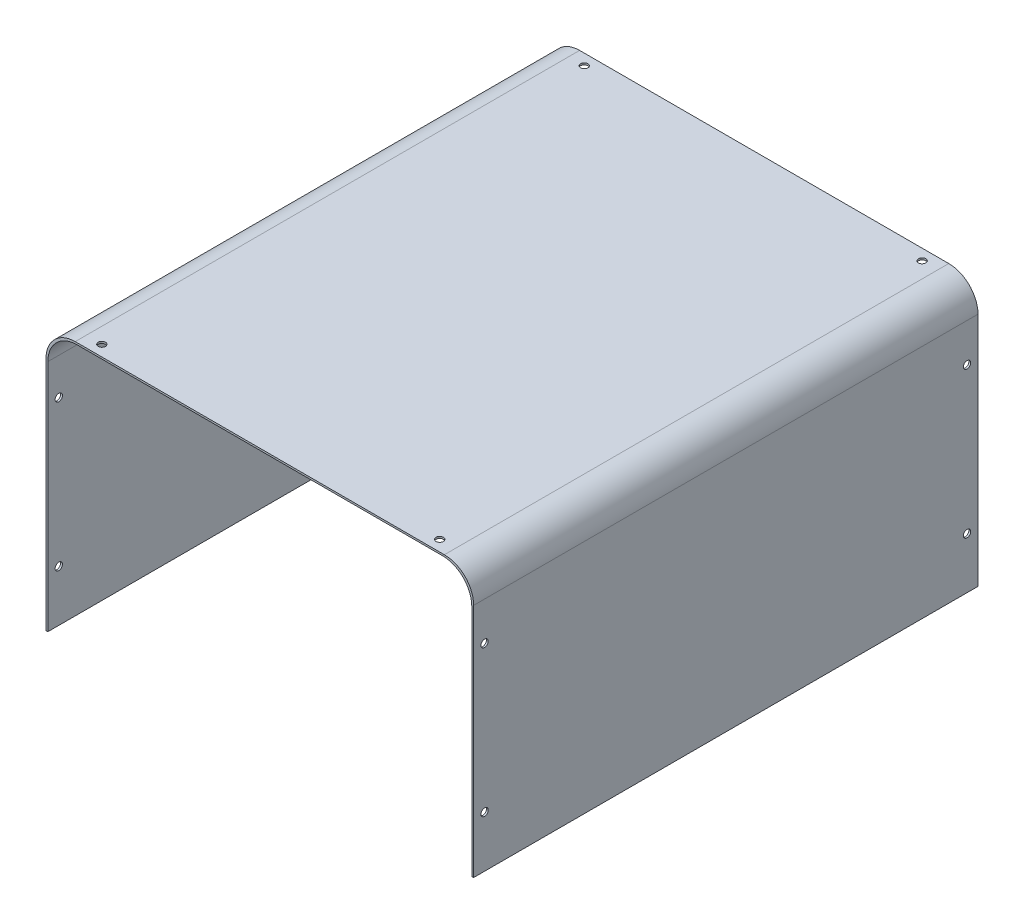
ISO-10303-21;
HEADER;
FILE_DESCRIPTION(('STEP AP214'),'2;1');
FILE_NAME('part.step','',(''),(''),'','','');
FILE_SCHEMA(('AUTOMOTIVE_DESIGN { 1 0 10303 214 1 1 1 1 }'));
ENDSEC;
DATA;
#1=APPLICATION_CONTEXT('core data for automotive mechanical design processes');
#2=APPLICATION_PROTOCOL_DEFINITION('international standard','automotive_design',2000,#1);
#3=PRODUCT_CONTEXT('',#1,'mechanical');
#4=PRODUCT('Part','Part','',(#3));
#5=PRODUCT_RELATED_PRODUCT_CATEGORY('part','',(#4));
#6=PRODUCT_DEFINITION_FORMATION('','',#4);
#7=PRODUCT_DEFINITION_CONTEXT('part definition',#1,'design');
#8=PRODUCT_DEFINITION('design','',#6,#7);
#9=PRODUCT_DEFINITION_SHAPE('','',#8);
#10=(LENGTH_UNIT() NAMED_UNIT(*) SI_UNIT(.MILLI.,.METRE.));
#11=(NAMED_UNIT(*) PLANE_ANGLE_UNIT() SI_UNIT($,.RADIAN.));
#12=(NAMED_UNIT(*) SI_UNIT($,.STERADIAN.) SOLID_ANGLE_UNIT());
#13=UNCERTAINTY_MEASURE_WITH_UNIT(LENGTH_MEASURE(1.E-05),#10,'distance_accuracy_value','');
#14=(GEOMETRIC_REPRESENTATION_CONTEXT(3) GLOBAL_UNCERTAINTY_ASSIGNED_CONTEXT((#13)) GLOBAL_UNIT_ASSIGNED_CONTEXT((#10,
#11,#12)) REPRESENTATION_CONTEXT('',''));
#15=CARTESIAN_POINT('',(0.,0.,0.));
#16=DIRECTION('',(0.,0.,1.));
#17=DIRECTION('',(1.,0.,0.));
#18=AXIS2_PLACEMENT_3D('',#15,#16,#17);
#19=CARTESIAN_POINT('',(0.,0.,0.));
#20=DIRECTION('',(0.,-1.,0.));
#21=DIRECTION('',(0.,0.,-1.));
#22=AXIS2_PLACEMENT_3D('',#19,#20,#21);
#23=PLANE('',#22);
#24=DIRECTION('',(0.,0.,1.));
#25=VECTOR('',#24,1.);
#26=CARTESIAN_POINT('',(91.2342816853104,0.,0.));
#27=LINE('',#26,#25);
#28=CARTESIAN_POINT('',(91.2342816853104,0.,-65.7659591772385));
#29=VERTEX_POINT('',#28);
#30=CARTESIAN_POINT('',(91.2342816853104,0.,72.2340408227615));
#31=VERTEX_POINT('',#30);
#32=EDGE_CURVE('E216',#29,#31,#27,.T.);
#33=ORIENTED_EDGE('',*,*,#32,.F.);
#34=DIRECTION('',(1.,0.,0.));
#35=VECTOR('',#34,1.);
#36=CARTESIAN_POINT('',(-25.2657183146879,0.,-65.7659591772385));
#37=LINE('',#36,#35);
#38=CARTESIAN_POINT('',(91.7342816853121,0.,-65.7659591772385));
#39=VERTEX_POINT('',#38);
#40=EDGE_CURVE('E194',#29,#39,#37,.T.);
#41=ORIENTED_EDGE('',*,*,#40,.T.);
#42=DIRECTION('',(0.,0.,1.));
#43=VECTOR('',#42,1.);
#44=CARTESIAN_POINT('',(91.7342816853121,0.,-65.7659591772385));
#45=LINE('',#44,#43);
#46=CARTESIAN_POINT('',(91.7342816853121,0.,72.2340408227615));
#47=VERTEX_POINT('',#46);
#48=EDGE_CURVE('E191',#39,#47,#45,.T.);
#49=ORIENTED_EDGE('',*,*,#48,.T.);
#50=DIRECTION('',(1.,0.,0.));
#51=VECTOR('',#50,1.);
#52=CARTESIAN_POINT('',(-25.2657183146879,0.,72.2340408227615));
#53=LINE('',#52,#51);
#54=EDGE_CURVE('E179',#31,#47,#53,.T.);
#55=ORIENTED_EDGE('',*,*,#54,.F.);
#56=EDGE_LOOP('',(#33,#41,#49,#55));
#57=FACE_BOUND('',#56,.T.);
#58=ADVANCED_FACE('F35',(#57),#23,.T.);
#59=CARTESIAN_POINT('',(91.7342816853121,72.5,-65.7659591772385));
#60=DIRECTION('',(1.,0.,0.));
#61=DIRECTION('',(0.,0.,-1.));
#62=AXIS2_PLACEMENT_3D('',#59,#60,#61);
#63=PLANE('',#62);
#64=CARTESIAN_POINT('',(91.7342816853121,14.,-62.7659591772386));
#65=DIRECTION('',(1.,0.,0.));
#66=DIRECTION('',(0.,0.,-1.));
#67=AXIS2_PLACEMENT_3D('',#64,#65,#66);
#68=CIRCLE('',#67,0.999999999999998);
#69=CARTESIAN_POINT('',(91.7342816853121,14.,-63.7659591772386));
#70=VERTEX_POINT('',#69);
#71=EDGE_CURVE('E147',#70,#70,#68,.T.);
#72=ORIENTED_EDGE('',*,*,#71,.F.);
#73=EDGE_LOOP('',(#72));
#74=FACE_BOUND('',#73,.T.);
#75=CARTESIAN_POINT('',(91.7342816853121,54.,69.2340408227615));
#76=DIRECTION('',(1.,0.,0.));
#77=DIRECTION('',(0.,0.,-1.));
#78=AXIS2_PLACEMENT_3D('',#75,#76,#77);
#79=CIRCLE('',#78,0.999999999999998);
#80=CARTESIAN_POINT('',(91.7342816853121,54.,68.2340408227615));
#81=VERTEX_POINT('',#80);
#82=EDGE_CURVE('E236',#81,#81,#79,.T.);
#83=ORIENTED_EDGE('',*,*,#82,.F.);
#84=EDGE_LOOP('',(#83));
#85=FACE_BOUND('',#84,.T.);
#86=CARTESIAN_POINT('',(91.7342816853121,14.,69.2340408227615));
#87=DIRECTION('',(1.,0.,0.));
#88=DIRECTION('',(0.,0.,-1.));
#89=AXIS2_PLACEMENT_3D('',#86,#87,#88);
#90=CIRCLE('',#89,0.999999999999998);
#91=CARTESIAN_POINT('',(91.7342816853121,14.,68.2340408227615));
#92=VERTEX_POINT('',#91);
#93=EDGE_CURVE('E232',#92,#92,#90,.T.);
#94=ORIENTED_EDGE('',*,*,#93,.F.);
#95=EDGE_LOOP('',(#94));
#96=FACE_BOUND('',#95,.T.);
#97=CARTESIAN_POINT('',(91.7342816853121,54.,-62.7659591772386));
#98=DIRECTION('',(1.,0.,0.));
#99=DIRECTION('',(0.,0.,-1.));
#100=AXIS2_PLACEMENT_3D('',#97,#98,#99);
#101=CIRCLE('',#100,0.999999999999998);
#102=CARTESIAN_POINT('',(91.7342816853121,54.,-63.7659591772386));
#103=VERTEX_POINT('',#102);
#104=EDGE_CURVE('E228',#103,#103,#101,.T.);
#105=ORIENTED_EDGE('',*,*,#104,.F.);
#106=EDGE_LOOP('',(#105));
#107=FACE_BOUND('',#106,.T.);
#108=DIRECTION('',(0.,-1.,0.));
#109=VECTOR('',#108,1.);
#110=CARTESIAN_POINT('',(91.7342816853121,72.5,-65.7659591772385));
#111=LINE('',#110,#109);
#112=CARTESIAN_POINT('',(91.7342816853121,64.4999999999999,-65.7659591772385));
#113=VERTEX_POINT('',#112);
#114=EDGE_CURVE('E203',#113,#39,#111,.T.);
#115=ORIENTED_EDGE('',*,*,#114,.F.);
#116=DIRECTION('',(0.,0.,-1.));
#117=VECTOR('',#116,1.);
#118=CARTESIAN_POINT('',(91.7342816853121,64.4999999999999,74.2340408227615));
#119=LINE('',#118,#117);
#120=CARTESIAN_POINT('',(91.7342816853121,64.4999999999999,72.2340408227615));
#121=VERTEX_POINT('',#120);
#122=EDGE_CURVE('E168',#121,#113,#119,.T.);
#123=ORIENTED_EDGE('',*,*,#122,.F.);
#124=DIRECTION('',(0.,-1.,0.));
#125=VECTOR('',#124,1.);
#126=CARTESIAN_POINT('',(91.7342816853121,72.5,72.2340408227615));
#127=LINE('',#126,#125);
#128=EDGE_CURVE('E206',#121,#47,#127,.T.);
#129=ORIENTED_EDGE('',*,*,#128,.T.);
#130=ORIENTED_EDGE('',*,*,#48,.F.);
#131=EDGE_LOOP('',(#115,#123,#129,#130));
#132=FACE_BOUND('',#131,.T.);
#133=ADVANCED_FACE('F256',(#74,#85,#96,#107,#132),#63,.T.);
#134=CARTESIAN_POINT('',(-25.2657183146879,72.5,-65.7659591772385));
#135=DIRECTION('',(1.,0.,0.));
#136=DIRECTION('',(0.,0.,-1.));
#137=AXIS2_PLACEMENT_3D('',#134,#135,#136);
#138=PLANE('',#137);
#139=CARTESIAN_POINT('',(-25.2657183146879,14.,-62.7659591772385));
#140=DIRECTION('',(-1.,0.,0.));
#141=DIRECTION('',(0.,0.,1.));
#142=AXIS2_PLACEMENT_3D('',#139,#140,#141);
#143=CIRCLE('',#142,0.999999999999998);
#144=CARTESIAN_POINT('',(-25.2657183146879,14.,-61.7659591772385));
#145=VERTEX_POINT('',#144);
#146=EDGE_CURVE('E332',#145,#145,#143,.T.);
#147=ORIENTED_EDGE('',*,*,#146,.F.);
#148=EDGE_LOOP('',(#147));
#149=FACE_BOUND('',#148,.T.);
#150=CARTESIAN_POINT('',(-25.2657183146879,54.,69.2340408227615));
#151=DIRECTION('',(-1.,0.,0.));
#152=DIRECTION('',(0.,0.,-1.));
#153=AXIS2_PLACEMENT_3D('',#150,#151,#152);
#154=CIRCLE('',#153,0.999999999999998);
#155=CARTESIAN_POINT('',(-25.2657183146879,54.,68.2340408227615));
#156=VERTEX_POINT('',#155);
#157=EDGE_CURVE('E336',#156,#156,#154,.T.);
#158=ORIENTED_EDGE('',*,*,#157,.F.);
#159=EDGE_LOOP('',(#158));
#160=FACE_BOUND('',#159,.T.);
#161=CARTESIAN_POINT('',(-25.2657183146879,14.,69.2340408227615));
#162=DIRECTION('',(-1.,0.,0.));
#163=DIRECTION('',(0.,0.,-1.));
#164=AXIS2_PLACEMENT_3D('',#161,#162,#163);
#165=CIRCLE('',#164,0.999999999999998);
#166=CARTESIAN_POINT('',(-25.2657183146879,14.,68.2340408227615));
#167=VERTEX_POINT('',#166);
#168=EDGE_CURVE('E340',#167,#167,#165,.T.);
#169=ORIENTED_EDGE('',*,*,#168,.F.);
#170=EDGE_LOOP('',(#169));
#171=FACE_BOUND('',#170,.T.);
#172=CARTESIAN_POINT('',(-25.2657183146879,54.,-62.7659591772385));
#173=DIRECTION('',(-1.,0.,0.));
#174=DIRECTION('',(0.,0.,1.));
#175=AXIS2_PLACEMENT_3D('',#172,#173,#174);
#176=CIRCLE('',#175,0.999999999999998);
#177=CARTESIAN_POINT('',(-25.2657183146879,54.,-61.7659591772385));
#178=VERTEX_POINT('',#177);
#179=EDGE_CURVE('E224',#178,#178,#176,.T.);
#180=ORIENTED_EDGE('',*,*,#179,.F.);
#181=EDGE_LOOP('',(#180));
#182=FACE_BOUND('',#181,.T.);
#183=DIRECTION('',(0.,0.,-1.));
#184=VECTOR('',#183,1.);
#185=CARTESIAN_POINT('',(-25.2657183146879,64.4999999999999,74.2340408227615));
#186=LINE('',#185,#184);
#187=CARTESIAN_POINT('',(-25.2657183146879,64.4999999999999,72.2340408227615));
#188=VERTEX_POINT('',#187);
#189=CARTESIAN_POINT('',(-25.2657183146879,64.4999999999999,-65.7659591772385));
#190=VERTEX_POINT('',#189);
#191=EDGE_CURVE('E167',#188,#190,#186,.T.);
#192=ORIENTED_EDGE('',*,*,#191,.T.);
#193=DIRECTION('',(0.,-1.,0.));
#194=VECTOR('',#193,1.);
#195=CARTESIAN_POINT('',(-25.2657183146879,72.5,-65.7659591772385));
#196=LINE('',#195,#194);
#197=CARTESIAN_POINT('',(-25.2657183146879,0.,-65.7659591772385));
#198=VERTEX_POINT('',#197);
#199=EDGE_CURVE('E201',#190,#198,#196,.T.);
#200=ORIENTED_EDGE('',*,*,#199,.T.);
#201=DIRECTION('',(0.,0.,1.));
#202=VECTOR('',#201,1.);
#203=CARTESIAN_POINT('',(-25.2657183146879,0.,-65.7659591772385));
#204=LINE('',#203,#202);
#205=CARTESIAN_POINT('',(-25.2657183146879,0.,72.2340408227615));
#206=VERTEX_POINT('',#205);
#207=EDGE_CURVE('E184',#198,#206,#204,.T.);
#208=ORIENTED_EDGE('',*,*,#207,.T.);
#209=DIRECTION('',(0.,-1.,0.));
#210=VECTOR('',#209,1.);
#211=CARTESIAN_POINT('',(-25.2657183146879,72.5,72.2340408227615));
#212=LINE('',#211,#210);
#213=EDGE_CURVE('E187',#188,#206,#212,.T.);
#214=ORIENTED_EDGE('',*,*,#213,.F.);
#215=EDGE_LOOP('',(#192,#200,#208,#214));
#216=FACE_BOUND('',#215,.T.);
#217=ADVANCED_FACE('F259',(#149,#160,#171,#182,#216),#138,.F.);
#218=CARTESIAN_POINT('',(0.,72.5,0.));
#219=DIRECTION('',(0.,-1.,0.));
#220=DIRECTION('',(0.,0.,-1.));
#221=AXIS2_PLACEMENT_3D('',#218,#219,#220);
#222=PLANE('',#221);
#223=CARTESIAN_POINT('',(79.4542912087594,72.5,-62.7659591772385));
#224=DIRECTION('',(0.,-1.,0.));
#225=DIRECTION('',(0.,0.,-1.));
#226=AXIS2_PLACEMENT_3D('',#223,#224,#225);
#227=CIRCLE('',#226,0.999999999999998);
#228=CARTESIAN_POINT('',(79.4542912087594,72.5,-63.7659591772385));
#229=VERTEX_POINT('',#228);
#230=EDGE_CURVE('E407',#229,#229,#227,.T.);
#231=ORIENTED_EDGE('',*,*,#230,.T.);
#232=EDGE_LOOP('',(#231));
#233=FACE_BOUND('',#232,.T.);
#234=CARTESIAN_POINT('',(-12.9857278381368,72.5,-62.7659591772385));
#235=DIRECTION('',(0.,-1.,0.));
#236=DIRECTION('',(0.,0.,-1.));
#237=AXIS2_PLACEMENT_3D('',#234,#235,#236);
#238=CIRCLE('',#237,0.999999999999998);
#239=CARTESIAN_POINT('',(-12.9857278381368,72.5,-63.7659591772385));
#240=VERTEX_POINT('',#239);
#241=EDGE_CURVE('E404',#240,#240,#238,.T.);
#242=ORIENTED_EDGE('',*,*,#241,.T.);
#243=EDGE_LOOP('',(#242));
#244=FACE_BOUND('',#243,.T.);
#245=CARTESIAN_POINT('',(-12.9857274004644,72.5,69.2340408227615));
#246=DIRECTION('',(0.,-1.,0.));
#247=DIRECTION('',(0.,0.,-1.));
#248=AXIS2_PLACEMENT_3D('',#245,#246,#247);
#249=CIRCLE('',#248,1.);
#250=CARTESIAN_POINT('',(-12.9857274004644,72.5,68.2340408227615));
#251=VERTEX_POINT('',#250);
#252=EDGE_CURVE('E401',#251,#251,#249,.T.);
#253=ORIENTED_EDGE('',*,*,#252,.T.);
#254=EDGE_LOOP('',(#253));
#255=FACE_BOUND('',#254,.T.);
#256=CARTESIAN_POINT('',(79.4542912087594,72.5,69.2340408227615));
#257=DIRECTION('',(0.,-1.,0.));
#258=DIRECTION('',(0.,0.,-1.));
#259=AXIS2_PLACEMENT_3D('',#256,#257,#258);
#260=CIRCLE('',#259,0.999999999999998);
#261=CARTESIAN_POINT('',(79.4542912087594,72.5,68.2340408227615));
#262=VERTEX_POINT('',#261);
#263=EDGE_CURVE('E398',#262,#262,#260,.T.);
#264=ORIENTED_EDGE('',*,*,#263,.T.);
#265=EDGE_LOOP('',(#264));
#266=FACE_BOUND('',#265,.T.);
#267=DIRECTION('',(1.,0.,0.));
#268=VECTOR('',#267,1.);
#269=CARTESIAN_POINT('',(-25.2657183146879,72.5,-65.7659591772385));
#270=LINE('',#269,#268);
#271=CARTESIAN_POINT('',(-17.2657183146878,72.5,-65.7659591772385));
#272=VERTEX_POINT('',#271);
#273=CARTESIAN_POINT('',(83.734281685312,72.5,-65.7659591772385));
#274=VERTEX_POINT('',#273);
#275=EDGE_CURVE('E183',#272,#274,#270,.T.);
#276=ORIENTED_EDGE('',*,*,#275,.F.);
#277=DIRECTION('',(0.,0.,-1.));
#278=VECTOR('',#277,1.);
#279=CARTESIAN_POINT('',(-17.2657183146879,72.5,74.2340408227615));
#280=LINE('',#279,#278);
#281=CARTESIAN_POINT('',(-17.2657183146879,72.5,72.2340408227615));
#282=VERTEX_POINT('',#281);
#283=EDGE_CURVE('E211',#272,#282,#280,.F.);
#284=ORIENTED_EDGE('',*,*,#283,.T.);
#285=DIRECTION('',(1.,0.,0.));
#286=VECTOR('',#285,1.);
#287=CARTESIAN_POINT('',(-25.2657183146879,72.5,72.2340408227615));
#288=LINE('',#287,#286);
#289=CARTESIAN_POINT('',(83.734281685312,72.5,72.2340408227615));
#290=VERTEX_POINT('',#289);
#291=EDGE_CURVE('E180',#282,#290,#288,.T.);
#292=ORIENTED_EDGE('',*,*,#291,.T.);
#293=DIRECTION('',(0.,0.,-1.));
#294=VECTOR('',#293,1.);
#295=CARTESIAN_POINT('',(83.7342816853121,72.5,74.2340408227615));
#296=LINE('',#295,#294);
#297=EDGE_CURVE('E209',#274,#290,#296,.F.);
#298=ORIENTED_EDGE('',*,*,#297,.F.);
#299=EDGE_LOOP('',(#276,#284,#292,#298));
#300=FACE_BOUND('',#299,.T.);
#301=ADVANCED_FACE('F278',(#233,#244,#255,#266,#300),#222,.F.);
#302=CARTESIAN_POINT('',(-25.2657183146879,72.5,72.2340408227615));
#303=DIRECTION('',(0.,0.,-1.));
#304=DIRECTION('',(-1.,0.,0.));
#305=AXIS2_PLACEMENT_3D('',#302,#303,#304);
#306=PLANE('',#305);
#307=CARTESIAN_POINT('',(83.2342816853104,63.999999999982,72.2340408227615));
#308=DIRECTION('',(0.,0.,1.));
#309=DIRECTION('',(-1.,0.,0.));
#310=AXIS2_PLACEMENT_3D('',#307,#308,#309);
#311=CIRCLE('',#310,8.);
#312=CARTESIAN_POINT('',(91.2342816853104,63.999999999982,72.2340408227615));
#313=VERTEX_POINT('',#312);
#314=CARTESIAN_POINT('',(83.2342816853104,71.999999999982,72.2340408227615));
#315=VERTEX_POINT('',#314);
#316=EDGE_CURVE('E140',#313,#315,#311,.T.);
#317=ORIENTED_EDGE('',*,*,#316,.F.);
#318=DIRECTION('',(0.,1.,0.));
#319=VECTOR('',#318,1.);
#320=CARTESIAN_POINT('',(91.2342816853104,0.,72.2340408227615));
#321=LINE('',#320,#319);
#322=EDGE_CURVE('E137',#31,#313,#321,.T.);
#323=ORIENTED_EDGE('',*,*,#322,.F.);
#324=ORIENTED_EDGE('',*,*,#54,.T.);
#325=ORIENTED_EDGE('',*,*,#128,.F.);
#326=CARTESIAN_POINT('',(83.7342816853121,64.5,72.2340408227615));
#327=DIRECTION('',(0.,0.,-1.));
#328=DIRECTION('',(-1.,0.,0.));
#329=AXIS2_PLACEMENT_3D('',#326,#327,#328);
#330=CIRCLE('',#329,7.99999999999999);
#331=EDGE_CURVE('E171',#121,#290,#330,.F.);
#332=ORIENTED_EDGE('',*,*,#331,.T.);
#333=ORIENTED_EDGE('',*,*,#291,.F.);
#334=CARTESIAN_POINT('',(-17.2657183146879,64.5,72.2340408227615));
#335=DIRECTION('',(0.,0.,-1.));
#336=DIRECTION('',(-1.,0.,0.));
#337=AXIS2_PLACEMENT_3D('',#334,#335,#336);
#338=CIRCLE('',#337,8.);
#339=EDGE_CURVE('E176',#282,#188,#338,.F.);
#340=ORIENTED_EDGE('',*,*,#339,.T.);
#341=ORIENTED_EDGE('',*,*,#213,.T.);
#342=CARTESIAN_POINT('',(-24.7657183146879,0.,72.2340408227615));
#343=VERTEX_POINT('',#342);
#344=EDGE_CURVE('E188',#206,#343,#53,.T.);
#345=ORIENTED_EDGE('',*,*,#344,.T.);
#346=DIRECTION('',(0.,-1.,0.));
#347=VECTOR('',#346,1.);
#348=CARTESIAN_POINT('',(-24.7657183146879,0.,72.2340408227615));
#349=LINE('',#348,#347);
#350=CARTESIAN_POINT('',(-24.7657183146879,63.999999999982,72.2340408227615));
#351=VERTEX_POINT('',#350);
#352=EDGE_CURVE('E52',#351,#343,#349,.T.);
#353=ORIENTED_EDGE('',*,*,#352,.F.);
#354=CARTESIAN_POINT('',(-16.7657183146879,63.999999999982,72.2340408227615));
#355=DIRECTION('',(0.,0.,1.));
#356=DIRECTION('',(-1.,0.,0.));
#357=AXIS2_PLACEMENT_3D('',#354,#355,#356);
#358=CIRCLE('',#357,8.);
#359=CARTESIAN_POINT('',(-16.7657183146878,71.999999999982,72.2340408227615));
#360=VERTEX_POINT('',#359);
#361=EDGE_CURVE('E150',#360,#351,#358,.T.);
#362=ORIENTED_EDGE('',*,*,#361,.F.);
#363=DIRECTION('',(-1.,0.,0.));
#364=VECTOR('',#363,1.);
#365=CARTESIAN_POINT('',(-16.7657183146878,71.999999999982,72.2340408227615));
#366=LINE('',#365,#364);
#367=EDGE_CURVE('E130',#315,#360,#366,.T.);
#368=ORIENTED_EDGE('',*,*,#367,.F.);
#369=EDGE_LOOP('',(#317,#323,#324,#325,#332,#333,#340,#341,#345,#353,#362,#368));
#370=FACE_BOUND('',#369,.T.);
#371=ADVANCED_FACE('F37',(#370),#306,.F.);
#372=CARTESIAN_POINT('',(-25.2657183146879,72.5,-65.7659591772385));
#373=DIRECTION('',(0.,0.,-1.));
#374=DIRECTION('',(-1.,0.,0.));
#375=AXIS2_PLACEMENT_3D('',#372,#373,#374);
#376=PLANE('',#375);
#377=DIRECTION('',(0.,-1.,0.));
#378=VECTOR('',#377,1.);
#379=CARTESIAN_POINT('',(91.2342816853104,72.5,-65.7659591772385));
#380=LINE('',#379,#378);
#381=CARTESIAN_POINT('',(91.2342816853104,63.999999999982,-65.7659591772385));
#382=VERTEX_POINT('',#381);
#383=EDGE_CURVE('E163',#382,#29,#380,.T.);
#384=ORIENTED_EDGE('',*,*,#383,.F.);
#385=CARTESIAN_POINT('',(83.2342816853104,63.999999999982,-65.7659591772385));
#386=DIRECTION('',(0.,0.,-1.));
#387=DIRECTION('',(-1.,0.,0.));
#388=AXIS2_PLACEMENT_3D('',#385,#386,#387);
#389=CIRCLE('',#388,8.);
#390=CARTESIAN_POINT('',(83.2342816853104,71.999999999982,-65.7659591772385));
#391=VERTEX_POINT('',#390);
#392=EDGE_CURVE('E11',#391,#382,#389,.T.);
#393=ORIENTED_EDGE('',*,*,#392,.F.);
#394=DIRECTION('',(1.,0.,0.));
#395=VECTOR('',#394,1.);
#396=CARTESIAN_POINT('',(-25.2657183146879,71.999999999982,-65.7659591772385));
#397=LINE('',#396,#395);
#398=CARTESIAN_POINT('',(-16.7657183146878,71.999999999982,-65.7659591772385));
#399=VERTEX_POINT('',#398);
#400=EDGE_CURVE('E133',#399,#391,#397,.T.);
#401=ORIENTED_EDGE('',*,*,#400,.F.);
#402=CARTESIAN_POINT('',(-16.7657183146879,63.999999999982,-65.7659591772385));
#403=DIRECTION('',(0.,0.,-1.));
#404=DIRECTION('',(-1.,0.,0.));
#405=AXIS2_PLACEMENT_3D('',#402,#403,#404);
#406=CIRCLE('',#405,8.);
#407=CARTESIAN_POINT('',(-24.7657183146879,63.999999999982,-65.7659591772385));
#408=VERTEX_POINT('',#407);
#409=EDGE_CURVE('E44',#408,#399,#406,.T.);
#410=ORIENTED_EDGE('',*,*,#409,.F.);
#411=DIRECTION('',(0.,1.,0.));
#412=VECTOR('',#411,1.);
#413=CARTESIAN_POINT('',(-24.7657183146879,72.5,-65.7659591772385));
#414=LINE('',#413,#412);
#415=CARTESIAN_POINT('',(-24.7657183146879,0.,-65.7659591772385));
#416=VERTEX_POINT('',#415);
#417=EDGE_CURVE('E158',#416,#408,#414,.T.);
#418=ORIENTED_EDGE('',*,*,#417,.F.);
#419=EDGE_CURVE('E195',#198,#416,#37,.T.);
#420=ORIENTED_EDGE('',*,*,#419,.F.);
#421=ORIENTED_EDGE('',*,*,#199,.F.);
#422=CARTESIAN_POINT('',(-17.2657183146879,64.5,-65.7659591772385));
#423=DIRECTION('',(0.,0.,1.));
#424=DIRECTION('',(1.,0.,0.));
#425=AXIS2_PLACEMENT_3D('',#422,#423,#424);
#426=CIRCLE('',#425,8.);
#427=EDGE_CURVE('E165',#272,#190,#426,.T.);
#428=ORIENTED_EDGE('',*,*,#427,.F.);
#429=ORIENTED_EDGE('',*,*,#275,.T.);
#430=CARTESIAN_POINT('',(83.7342816853121,64.5,-65.7659591772385));
#431=DIRECTION('',(0.,0.,1.));
#432=DIRECTION('',(-1.,0.,0.));
#433=AXIS2_PLACEMENT_3D('',#430,#431,#432);
#434=CIRCLE('',#433,7.99999999999999);
#435=EDGE_CURVE('E60',#113,#274,#434,.T.);
#436=ORIENTED_EDGE('',*,*,#435,.F.);
#437=ORIENTED_EDGE('',*,*,#114,.T.);
#438=ORIENTED_EDGE('',*,*,#40,.F.);
#439=EDGE_LOOP('',(#384,#393,#401,#410,#418,#420,#421,#428,#429,#436,#437,#438));
#440=FACE_BOUND('',#439,.T.);
#441=ADVANCED_FACE('F273',(#440),#376,.T.);
#442=DIRECTION('',(0.,0.,-1.));
#443=VECTOR('',#442,1.);
#444=CARTESIAN_POINT('',(-24.7657183146879,0.,0.));
#445=LINE('',#444,#443);
#446=EDGE_CURVE('E214',#343,#416,#445,.T.);
#447=ORIENTED_EDGE('',*,*,#446,.F.);
#448=ORIENTED_EDGE('',*,*,#344,.F.);
#449=ORIENTED_EDGE('',*,*,#207,.F.);
#450=ORIENTED_EDGE('',*,*,#419,.T.);
#451=EDGE_LOOP('',(#447,#448,#449,#450));
#452=FACE_BOUND('',#451,.T.);
#453=ADVANCED_FACE('F295',(#452),#23,.T.);
#454=CARTESIAN_POINT('',(83.7342816853121,64.5,74.2340408227615));
#455=DIRECTION('',(0.,0.,-1.));
#456=DIRECTION('',(-1.,0.,0.));
#457=AXIS2_PLACEMENT_3D('',#454,#455,#456);
#458=CYLINDRICAL_SURFACE('',#457,7.99999999999999);
#459=ORIENTED_EDGE('',*,*,#122,.T.);
#460=ORIENTED_EDGE('',*,*,#435,.T.);
#461=ORIENTED_EDGE('',*,*,#297,.T.);
#462=ORIENTED_EDGE('',*,*,#331,.F.);
#463=EDGE_LOOP('',(#459,#460,#461,#462));
#464=FACE_BOUND('',#463,.T.);
#465=ADVANCED_FACE('F280',(#464),#458,.T.);
#466=CARTESIAN_POINT('',(-17.2657183146879,64.5,74.2340408227615));
#467=DIRECTION('',(0.,0.,-1.));
#468=DIRECTION('',(-1.,0.,0.));
#469=AXIS2_PLACEMENT_3D('',#466,#467,#468);
#470=CYLINDRICAL_SURFACE('',#469,8.);
#471=ORIENTED_EDGE('',*,*,#283,.F.);
#472=ORIENTED_EDGE('',*,*,#427,.T.);
#473=ORIENTED_EDGE('',*,*,#191,.F.);
#474=ORIENTED_EDGE('',*,*,#339,.F.);
#475=EDGE_LOOP('',(#471,#472,#473,#474));
#476=FACE_BOUND('',#475,.T.);
#477=ADVANCED_FACE('F300',(#476),#470,.T.);
#478=CARTESIAN_POINT('',(83.2342816853104,63.999999999982,-67.7659591772385));
#479=DIRECTION('',(0.,0.,1.));
#480=DIRECTION('',(1.,0.,0.));
#481=AXIS2_PLACEMENT_3D('',#478,#479,#480);
#482=CYLINDRICAL_SURFACE('',#481,8.);
#483=ORIENTED_EDGE('',*,*,#392,.T.);
#484=DIRECTION('',(0.,0.,1.));
#485=VECTOR('',#484,1.);
#486=CARTESIAN_POINT('',(91.2342816853104,63.999999999982,-67.7659591772385));
#487=LINE('',#486,#485);
#488=EDGE_CURVE('E143',#382,#313,#487,.T.);
#489=ORIENTED_EDGE('',*,*,#488,.T.);
#490=ORIENTED_EDGE('',*,*,#316,.T.);
#491=DIRECTION('',(0.,0.,1.));
#492=VECTOR('',#491,1.);
#493=CARTESIAN_POINT('',(83.2342816853104,71.999999999982,-67.7659591772385));
#494=LINE('',#493,#492);
#495=EDGE_CURVE('E125',#391,#315,#494,.T.);
#496=ORIENTED_EDGE('',*,*,#495,.F.);
#497=EDGE_LOOP('',(#483,#489,#490,#496));
#498=FACE_BOUND('',#497,.T.);
#499=ADVANCED_FACE('F141',(#498),#482,.F.);
#500=CARTESIAN_POINT('',(91.2342816853104,0.,-67.7659591772385));
#501=DIRECTION('',(1.,0.,0.));
#502=DIRECTION('',(0.,0.,-1.));
#503=AXIS2_PLACEMENT_3D('',#500,#501,#502);
#504=PLANE('',#503);
#505=CARTESIAN_POINT('',(91.2342816853104,14.,-62.7659591772386));
#506=DIRECTION('',(1.,0.,0.));
#507=DIRECTION('',(0.,0.,-1.));
#508=AXIS2_PLACEMENT_3D('',#505,#506,#507);
#509=CIRCLE('',#508,0.999999999999998);
#510=CARTESIAN_POINT('',(91.2342816853104,14.,-63.7659591772386));
#511=VERTEX_POINT('',#510);
#512=EDGE_CURVE('E248',#511,#511,#509,.T.);
#513=ORIENTED_EDGE('',*,*,#512,.T.);
#514=EDGE_LOOP('',(#513));
#515=FACE_BOUND('',#514,.T.);
#516=CARTESIAN_POINT('',(91.2342816853104,54.,69.2340408227615));
#517=DIRECTION('',(1.,0.,0.));
#518=DIRECTION('',(0.,0.,-1.));
#519=AXIS2_PLACEMENT_3D('',#516,#517,#518);
#520=CIRCLE('',#519,0.999999999999998);
#521=CARTESIAN_POINT('',(91.2342816853104,54.,68.2340408227615));
#522=VERTEX_POINT('',#521);
#523=EDGE_CURVE('E231',#522,#522,#520,.T.);
#524=ORIENTED_EDGE('',*,*,#523,.T.);
#525=EDGE_LOOP('',(#524));
#526=FACE_BOUND('',#525,.T.);
#527=CARTESIAN_POINT('',(91.2342816853104,14.,69.2340408227615));
#528=DIRECTION('',(1.,0.,0.));
#529=DIRECTION('',(0.,0.,-1.));
#530=AXIS2_PLACEMENT_3D('',#527,#528,#529);
#531=CIRCLE('',#530,0.999999999999998);
#532=CARTESIAN_POINT('',(91.2342816853104,14.,68.2340408227615));
#533=VERTEX_POINT('',#532);
#534=EDGE_CURVE('E227',#533,#533,#531,.T.);
#535=ORIENTED_EDGE('',*,*,#534,.T.);
#536=EDGE_LOOP('',(#535));
#537=FACE_BOUND('',#536,.T.);
#538=CARTESIAN_POINT('',(91.2342816853104,54.,-62.7659591772386));
#539=DIRECTION('',(1.,0.,0.));
#540=DIRECTION('',(0.,0.,-1.));
#541=AXIS2_PLACEMENT_3D('',#538,#539,#540);
#542=CIRCLE('',#541,0.999999999999998);
#543=CARTESIAN_POINT('',(91.2342816853104,54.,-63.7659591772386));
#544=VERTEX_POINT('',#543);
#545=EDGE_CURVE('E223',#544,#544,#542,.T.);
#546=ORIENTED_EDGE('',*,*,#545,.T.);
#547=EDGE_LOOP('',(#546));
#548=FACE_BOUND('',#547,.T.);
#549=ORIENTED_EDGE('',*,*,#383,.T.);
#550=ORIENTED_EDGE('',*,*,#32,.T.);
#551=ORIENTED_EDGE('',*,*,#322,.T.);
#552=ORIENTED_EDGE('',*,*,#488,.F.);
#553=EDGE_LOOP('',(#549,#550,#551,#552));
#554=FACE_BOUND('',#553,.T.);
#555=ADVANCED_FACE('F285',(#515,#526,#537,#548,#554),#504,.F.);
#556=CARTESIAN_POINT('',(-24.7657183146879,0.,-67.7659591772385));
#557=DIRECTION('',(-1.,0.,0.));
#558=DIRECTION('',(0.,-1.,0.));
#559=AXIS2_PLACEMENT_3D('',#556,#557,#558);
#560=PLANE('',#559);
#561=CARTESIAN_POINT('',(-24.7657183146879,14.,-62.7659591772385));
#562=DIRECTION('',(-1.,0.,0.));
#563=DIRECTION('',(0.,-1.,0.));
#564=AXIS2_PLACEMENT_3D('',#561,#562,#563);
#565=CIRCLE('',#564,0.999999999999998);
#566=CARTESIAN_POINT('',(-24.7657183146879,13.,-62.7659591772385));
#567=VERTEX_POINT('',#566);
#568=EDGE_CURVE('E39',#567,#567,#565,.T.);
#569=ORIENTED_EDGE('',*,*,#568,.T.);
#570=EDGE_LOOP('',(#569));
#571=FACE_BOUND('',#570,.T.);
#572=CARTESIAN_POINT('',(-24.7657183146879,54.,69.2340408227615));
#573=DIRECTION('',(-1.,0.,0.));
#574=DIRECTION('',(0.,-1.,0.));
#575=AXIS2_PLACEMENT_3D('',#572,#573,#574);
#576=CIRCLE('',#575,0.999999999999998);
#577=CARTESIAN_POINT('',(-24.7657183146879,53.,69.2340408227615));
#578=VERTEX_POINT('',#577);
#579=EDGE_CURVE('E229',#578,#578,#576,.T.);
#580=ORIENTED_EDGE('',*,*,#579,.T.);
#581=EDGE_LOOP('',(#580));
#582=FACE_BOUND('',#581,.T.);
#583=CARTESIAN_POINT('',(-24.7657183146879,14.,69.2340408227615));
#584=DIRECTION('',(-1.,0.,0.));
#585=DIRECTION('',(0.,-1.,0.));
#586=AXIS2_PLACEMENT_3D('',#583,#584,#585);
#587=CIRCLE('',#586,0.999999999999998);
#588=CARTESIAN_POINT('',(-24.7657183146879,13.,69.2340408227615));
#589=VERTEX_POINT('',#588);
#590=EDGE_CURVE('E225',#589,#589,#587,.T.);
#591=ORIENTED_EDGE('',*,*,#590,.T.);
#592=EDGE_LOOP('',(#591));
#593=FACE_BOUND('',#592,.T.);
#594=CARTESIAN_POINT('',(-24.7657183146879,54.,-62.7659591772385));
#595=DIRECTION('',(-1.,0.,0.));
#596=DIRECTION('',(0.,-1.,0.));
#597=AXIS2_PLACEMENT_3D('',#594,#595,#596);
#598=CIRCLE('',#597,0.999999999999998);
#599=CARTESIAN_POINT('',(-24.7657183146879,53.,-62.7659591772385));
#600=VERTEX_POINT('',#599);
#601=EDGE_CURVE('E220',#600,#600,#598,.T.);
#602=ORIENTED_EDGE('',*,*,#601,.T.);
#603=EDGE_LOOP('',(#602));
#604=FACE_BOUND('',#603,.T.);
#605=ORIENTED_EDGE('',*,*,#417,.T.);
#606=DIRECTION('',(0.,0.,1.));
#607=VECTOR('',#606,1.);
#608=CARTESIAN_POINT('',(-24.7657183146879,63.999999999982,-67.7659591772385));
#609=LINE('',#608,#607);
#610=EDGE_CURVE('E159',#408,#351,#609,.T.);
#611=ORIENTED_EDGE('',*,*,#610,.T.);
#612=ORIENTED_EDGE('',*,*,#352,.T.);
#613=ORIENTED_EDGE('',*,*,#446,.T.);
#614=EDGE_LOOP('',(#605,#611,#612,#613));
#615=FACE_BOUND('',#614,.T.);
#616=ADVANCED_FACE('F292',(#571,#582,#593,#604,#615),#560,.F.);
#617=CARTESIAN_POINT('',(-16.7657183146879,63.999999999982,-67.7659591772385));
#618=DIRECTION('',(0.,0.,1.));
#619=DIRECTION('',(1.,0.,0.));
#620=AXIS2_PLACEMENT_3D('',#617,#618,#619);
#621=CYLINDRICAL_SURFACE('',#620,8.);
#622=ORIENTED_EDGE('',*,*,#409,.T.);
#623=DIRECTION('',(0.,0.,1.));
#624=VECTOR('',#623,1.);
#625=CARTESIAN_POINT('',(-16.7657183146878,71.999999999982,-67.7659591772385));
#626=LINE('',#625,#624);
#627=EDGE_CURVE('E136',#399,#360,#626,.T.);
#628=ORIENTED_EDGE('',*,*,#627,.T.);
#629=ORIENTED_EDGE('',*,*,#361,.T.);
#630=ORIENTED_EDGE('',*,*,#610,.F.);
#631=EDGE_LOOP('',(#622,#628,#629,#630));
#632=FACE_BOUND('',#631,.T.);
#633=ADVANCED_FACE('F291',(#632),#621,.F.);
#634=CARTESIAN_POINT('',(-16.7657183146878,71.999999999982,-67.7659591772385));
#635=DIRECTION('',(0.,1.,0.));
#636=DIRECTION('',(0.,0.,1.));
#637=AXIS2_PLACEMENT_3D('',#634,#635,#636);
#638=PLANE('',#637);
#639=CARTESIAN_POINT('',(79.4542912087594,71.999999999982,-62.7659591772385));
#640=DIRECTION('',(0.,-1.,0.));
#641=DIRECTION('',(0.,0.,-1.));
#642=AXIS2_PLACEMENT_3D('',#639,#640,#641);
#643=CIRCLE('',#642,0.999999999999998);
#644=CARTESIAN_POINT('',(79.4542912087594,71.999999999982,-63.7659591772385));
#645=VERTEX_POINT('',#644);
#646=EDGE_CURVE('E381',#645,#645,#643,.T.);
#647=ORIENTED_EDGE('',*,*,#646,.F.);
#648=EDGE_LOOP('',(#647));
#649=FACE_BOUND('',#648,.T.);
#650=CARTESIAN_POINT('',(-12.9857278381368,71.999999999982,-62.7659591772385));
#651=DIRECTION('',(0.,-1.,0.));
#652=DIRECTION('',(0.,0.,1.));
#653=AXIS2_PLACEMENT_3D('',#650,#651,#652);
#654=CIRCLE('',#653,0.999999999999998);
#655=CARTESIAN_POINT('',(-12.9857278381368,71.999999999982,-61.7659591772385));
#656=VERTEX_POINT('',#655);
#657=EDGE_CURVE('E385',#656,#656,#654,.T.);
#658=ORIENTED_EDGE('',*,*,#657,.F.);
#659=EDGE_LOOP('',(#658));
#660=FACE_BOUND('',#659,.T.);
#661=CARTESIAN_POINT('',(-12.9857274004644,71.999999999982,69.2340408227615));
#662=DIRECTION('',(0.,-1.,0.));
#663=DIRECTION('',(0.,0.,1.));
#664=AXIS2_PLACEMENT_3D('',#661,#662,#663);
#665=CIRCLE('',#664,1.);
#666=CARTESIAN_POINT('',(-12.9857274004644,71.999999999982,70.2340408227615));
#667=VERTEX_POINT('',#666);
#668=EDGE_CURVE('E389',#667,#667,#665,.T.);
#669=ORIENTED_EDGE('',*,*,#668,.F.);
#670=EDGE_LOOP('',(#669));
#671=FACE_BOUND('',#670,.T.);
#672=CARTESIAN_POINT('',(79.4542912087594,71.999999999982,69.2340408227615));
#673=DIRECTION('',(0.,-1.,0.));
#674=DIRECTION('',(0.,0.,1.));
#675=AXIS2_PLACEMENT_3D('',#672,#673,#674);
#676=CIRCLE('',#675,0.999999999999998);
#677=CARTESIAN_POINT('',(79.4542912087594,71.999999999982,70.2340408227615));
#678=VERTEX_POINT('',#677);
#679=EDGE_CURVE('E392',#678,#678,#676,.T.);
#680=ORIENTED_EDGE('',*,*,#679,.F.);
#681=EDGE_LOOP('',(#680));
#682=FACE_BOUND('',#681,.T.);
#683=ORIENTED_EDGE('',*,*,#400,.T.);
#684=ORIENTED_EDGE('',*,*,#495,.T.);
#685=ORIENTED_EDGE('',*,*,#367,.T.);
#686=ORIENTED_EDGE('',*,*,#627,.F.);
#687=EDGE_LOOP('',(#683,#684,#685,#686));
#688=FACE_BOUND('',#687,.T.);
#689=ADVANCED_FACE('F127',(#649,#660,#671,#682,#688),#638,.F.);
#690=CARTESIAN_POINT('',(114.734281685312,54.,-62.7659591772386));
#691=DIRECTION('',(-1.,0.,0.));
#692=DIRECTION('',(0.,0.,1.));
#693=AXIS2_PLACEMENT_3D('',#690,#691,#692);
#694=CYLINDRICAL_SURFACE('',#693,0.999999999999998);
#695=ORIENTED_EDGE('',*,*,#179,.T.);
#696=EDGE_LOOP('',(#695));
#697=FACE_BOUND('',#696,.T.);
#698=ORIENTED_EDGE('',*,*,#601,.F.);
#699=EDGE_LOOP('',(#698));
#700=FACE_BOUND('',#699,.T.);
#701=ADVANCED_FACE('F356',(#697,#700),#694,.F.);
#702=CARTESIAN_POINT('',(114.734281685312,14.,69.2340408227615));
#703=DIRECTION('',(-1.,0.,0.));
#704=DIRECTION('',(0.,0.,1.));
#705=AXIS2_PLACEMENT_3D('',#702,#703,#704);
#706=CYLINDRICAL_SURFACE('',#705,0.999999999999998);
#707=ORIENTED_EDGE('',*,*,#168,.T.);
#708=EDGE_LOOP('',(#707));
#709=FACE_BOUND('',#708,.T.);
#710=ORIENTED_EDGE('',*,*,#590,.F.);
#711=EDGE_LOOP('',(#710));
#712=FACE_BOUND('',#711,.T.);
#713=ADVANCED_FACE('F377',(#709,#712),#706,.F.);
#714=CARTESIAN_POINT('',(114.734281685312,54.,69.2340408227615));
#715=DIRECTION('',(-1.,0.,0.));
#716=DIRECTION('',(0.,0.,1.));
#717=AXIS2_PLACEMENT_3D('',#714,#715,#716);
#718=CYLINDRICAL_SURFACE('',#717,0.999999999999998);
#719=ORIENTED_EDGE('',*,*,#157,.T.);
#720=EDGE_LOOP('',(#719));
#721=FACE_BOUND('',#720,.T.);
#722=ORIENTED_EDGE('',*,*,#579,.F.);
#723=EDGE_LOOP('',(#722));
#724=FACE_BOUND('',#723,.T.);
#725=ADVANCED_FACE('F412',(#721,#724),#718,.F.);
#726=CARTESIAN_POINT('',(114.734281685312,14.,-62.7659591772386));
#727=DIRECTION('',(-1.,0.,0.));
#728=DIRECTION('',(0.,0.,1.));
#729=AXIS2_PLACEMENT_3D('',#726,#727,#728);
#730=CYLINDRICAL_SURFACE('',#729,0.999999999999998);
#731=ORIENTED_EDGE('',*,*,#146,.T.);
#732=EDGE_LOOP('',(#731));
#733=FACE_BOUND('',#732,.T.);
#734=ORIENTED_EDGE('',*,*,#568,.F.);
#735=EDGE_LOOP('',(#734));
#736=FACE_BOUND('',#735,.T.);
#737=ADVANCED_FACE('F354',(#733,#736),#730,.F.);
#738=ORIENTED_EDGE('',*,*,#104,.T.);
#739=EDGE_LOOP('',(#738));
#740=FACE_BOUND('',#739,.T.);
#741=ORIENTED_EDGE('',*,*,#545,.F.);
#742=EDGE_LOOP('',(#741));
#743=FACE_BOUND('',#742,.T.);
#744=ADVANCED_FACE('F350',(#740,#743),#694,.F.);
#745=ORIENTED_EDGE('',*,*,#93,.T.);
#746=EDGE_LOOP('',(#745));
#747=FACE_BOUND('',#746,.T.);
#748=ORIENTED_EDGE('',*,*,#534,.F.);
#749=EDGE_LOOP('',(#748));
#750=FACE_BOUND('',#749,.T.);
#751=ADVANCED_FACE('F353',(#747,#750),#706,.F.);
#752=ORIENTED_EDGE('',*,*,#82,.T.);
#753=EDGE_LOOP('',(#752));
#754=FACE_BOUND('',#753,.T.);
#755=ORIENTED_EDGE('',*,*,#523,.F.);
#756=EDGE_LOOP('',(#755));
#757=FACE_BOUND('',#756,.T.);
#758=ADVANCED_FACE('F415',(#754,#757),#718,.F.);
#759=ORIENTED_EDGE('',*,*,#71,.T.);
#760=EDGE_LOOP('',(#759));
#761=FACE_BOUND('',#760,.T.);
#762=ORIENTED_EDGE('',*,*,#512,.F.);
#763=EDGE_LOOP('',(#762));
#764=FACE_BOUND('',#763,.T.);
#765=ADVANCED_FACE('F253',(#761,#764),#730,.F.);
#766=CARTESIAN_POINT('',(79.4542912087594,211.999999999982,69.2340408227615));
#767=DIRECTION('',(0.,-1.,0.));
#768=DIRECTION('',(0.,0.,-1.));
#769=AXIS2_PLACEMENT_3D('',#766,#767,#768);
#770=CYLINDRICAL_SURFACE('',#769,0.999999999999998);
#771=ORIENTED_EDGE('',*,*,#679,.T.);
#772=EDGE_LOOP('',(#771));
#773=FACE_BOUND('',#772,.T.);
#774=ORIENTED_EDGE('',*,*,#263,.F.);
#775=EDGE_LOOP('',(#774));
#776=FACE_BOUND('',#775,.T.);
#777=ADVANCED_FACE('F429',(#773,#776),#770,.F.);
#778=CARTESIAN_POINT('',(-12.9857274004644,211.999999999982,69.2340408227615));
#779=DIRECTION('',(0.,-1.,0.));
#780=DIRECTION('',(0.,0.,-1.));
#781=AXIS2_PLACEMENT_3D('',#778,#779,#780);
#782=CYLINDRICAL_SURFACE('',#781,1.);
#783=ORIENTED_EDGE('',*,*,#668,.T.);
#784=EDGE_LOOP('',(#783));
#785=FACE_BOUND('',#784,.T.);
#786=ORIENTED_EDGE('',*,*,#252,.F.);
#787=EDGE_LOOP('',(#786));
#788=FACE_BOUND('',#787,.T.);
#789=ADVANCED_FACE('F440',(#785,#788),#782,.F.);
#790=CARTESIAN_POINT('',(-12.9857278381368,211.999999999982,-62.7659591772385));
#791=DIRECTION('',(0.,-1.,0.));
#792=DIRECTION('',(0.,0.,-1.));
#793=AXIS2_PLACEMENT_3D('',#790,#791,#792);
#794=CYLINDRICAL_SURFACE('',#793,0.999999999999998);
#795=ORIENTED_EDGE('',*,*,#657,.T.);
#796=EDGE_LOOP('',(#795));
#797=FACE_BOUND('',#796,.T.);
#798=ORIENTED_EDGE('',*,*,#241,.F.);
#799=EDGE_LOOP('',(#798));
#800=FACE_BOUND('',#799,.T.);
#801=ADVANCED_FACE('F443',(#797,#800),#794,.F.);
#802=CARTESIAN_POINT('',(79.4542912087594,211.999999999982,-62.7659591772385));
#803=DIRECTION('',(0.,-1.,0.));
#804=DIRECTION('',(0.,0.,-1.));
#805=AXIS2_PLACEMENT_3D('',#802,#803,#804);
#806=CYLINDRICAL_SURFACE('',#805,0.999999999999998);
#807=ORIENTED_EDGE('',*,*,#646,.T.);
#808=EDGE_LOOP('',(#807));
#809=FACE_BOUND('',#808,.T.);
#810=ORIENTED_EDGE('',*,*,#230,.F.);
#811=EDGE_LOOP('',(#810));
#812=FACE_BOUND('',#811,.T.);
#813=ADVANCED_FACE('F447',(#809,#812),#806,.F.);
#814=CLOSED_SHELL('',(#58,#133,#217,#301,#371,#441,#453,#465,#477,#499,#555,#616,#633,#689,#701,
#713,#725,#737,#744,#751,#758,#765,#777,#789,#801,#813));
#815=MANIFOLD_SOLID_BREP('B2',#814);
#816=ADVANCED_BREP_SHAPE_REPRESENTATION('',(#18,#815),#14);
#817=SHAPE_DEFINITION_REPRESENTATION(#9,#816);
ENDSEC;
END-ISO-10303-21;
